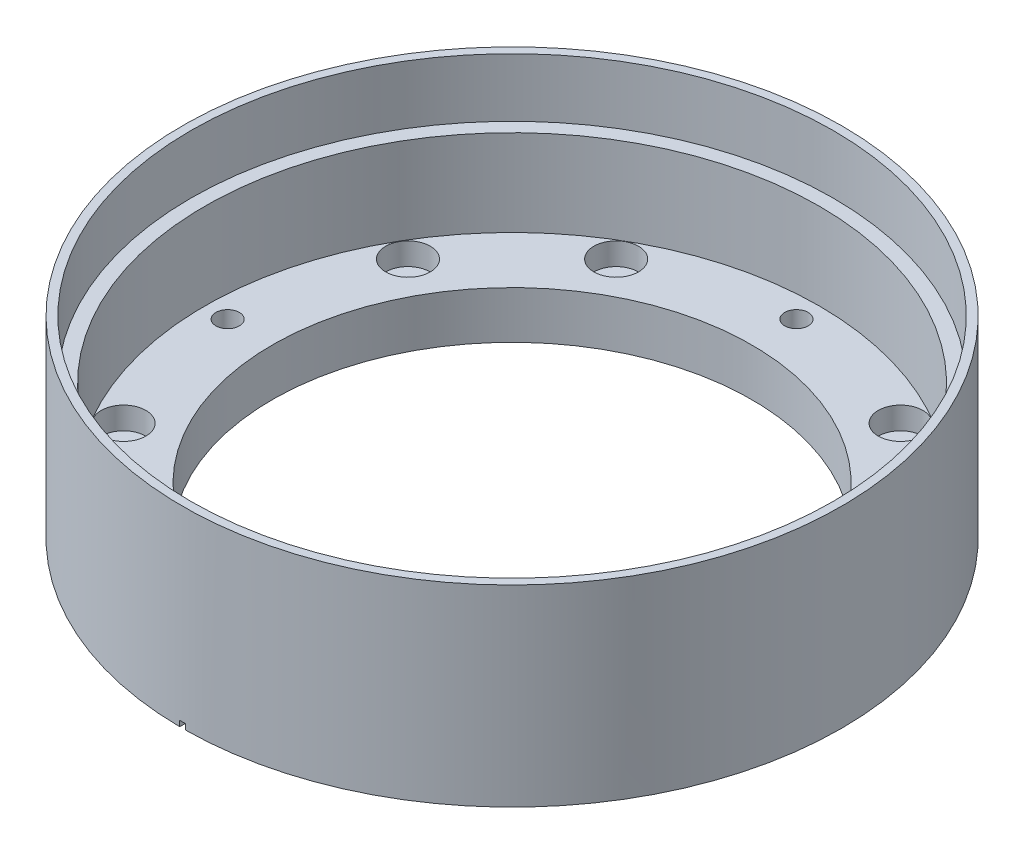
ISO-10303-21;
HEADER;
FILE_DESCRIPTION(('STEP AP214'),'2;1');
FILE_NAME('part.step','',(''),(''),'','','');
FILE_SCHEMA(('AUTOMOTIVE_DESIGN { 1 0 10303 214 1 1 1 1 }'));
ENDSEC;
DATA;
#1=APPLICATION_CONTEXT('core data for automotive mechanical design processes');
#2=APPLICATION_PROTOCOL_DEFINITION('international standard','automotive_design',2000,#1);
#3=PRODUCT_CONTEXT('',#1,'mechanical');
#4=PRODUCT('Part','Part','',(#3));
#5=PRODUCT_RELATED_PRODUCT_CATEGORY('part','',(#4));
#6=PRODUCT_DEFINITION_FORMATION('','',#4);
#7=PRODUCT_DEFINITION_CONTEXT('part definition',#1,'design');
#8=PRODUCT_DEFINITION('design','',#6,#7);
#9=PRODUCT_DEFINITION_SHAPE('','',#8);
#10=(LENGTH_UNIT() NAMED_UNIT(*) SI_UNIT(.MILLI.,.METRE.));
#11=(NAMED_UNIT(*) PLANE_ANGLE_UNIT() SI_UNIT($,.RADIAN.));
#12=(NAMED_UNIT(*) SI_UNIT($,.STERADIAN.) SOLID_ANGLE_UNIT());
#13=UNCERTAINTY_MEASURE_WITH_UNIT(LENGTH_MEASURE(1.E-05),#10,'distance_accuracy_value','');
#14=(GEOMETRIC_REPRESENTATION_CONTEXT(3) GLOBAL_UNCERTAINTY_ASSIGNED_CONTEXT((#13)) GLOBAL_UNIT_ASSIGNED_CONTEXT((#10,
#11,#12)) REPRESENTATION_CONTEXT('',''));
#15=CARTESIAN_POINT('',(0.,0.,0.));
#16=DIRECTION('',(0.,0.,1.));
#17=DIRECTION('',(1.,0.,0.));
#18=AXIS2_PLACEMENT_3D('',#15,#16,#17);
#19=CARTESIAN_POINT('',(0.,34.5,0.));
#20=DIRECTION('',(0.,1.,0.));
#21=DIRECTION('',(0.,0.,1.));
#22=AXIS2_PLACEMENT_3D('',#19,#20,#21);
#23=PLANE('',#22);
#24=CARTESIAN_POINT('',(0.,34.5,0.));
#25=DIRECTION('',(0.,1.,0.));
#26=DIRECTION('',(0.,0.,1.));
#27=AXIS2_PLACEMENT_3D('',#24,#25,#26);
#28=CIRCLE('',#27,57.6);
#29=CARTESIAN_POINT('',(0.,34.5,57.6));
#30=VERTEX_POINT('',#29);
#31=EDGE_CURVE('E254',#30,#30,#28,.T.);
#32=ORIENTED_EDGE('',*,*,#31,.F.);
#33=EDGE_LOOP('',(#32));
#34=FACE_BOUND('',#33,.T.);
#35=CARTESIAN_POINT('',(0.,34.5,0.));
#36=DIRECTION('',(0.,-1.,0.));
#37=DIRECTION('',(0.,0.,-1.));
#38=AXIS2_PLACEMENT_3D('',#35,#36,#37);
#39=CIRCLE('',#38,59.1);
#40=CARTESIAN_POINT('',(0.,34.5,-59.1));
#41=VERTEX_POINT('',#40);
#42=EDGE_CURVE('E152',#41,#41,#39,.T.);
#43=ORIENTED_EDGE('',*,*,#42,.F.);
#44=EDGE_LOOP('',(#43));
#45=FACE_BOUND('',#44,.T.);
#46=ADVANCED_FACE('F40',(#34,#45),#23,.T.);
#47=CARTESIAN_POINT('',(0.,0.,0.));
#48=DIRECTION('',(0.,1.,0.));
#49=DIRECTION('',(0.,0.,1.));
#50=AXIS2_PLACEMENT_3D('',#47,#48,#49);
#51=PLANE('',#50);
#52=CARTESIAN_POINT('',(0.,0.,0.));
#53=DIRECTION('',(0.,1.,0.));
#54=DIRECTION('',(0.,0.,1.));
#55=AXIS2_PLACEMENT_3D('',#52,#53,#54);
#56=CIRCLE('',#55,43.);
#57=CARTESIAN_POINT('',(0.,0.,43.));
#58=VERTEX_POINT('',#57);
#59=EDGE_CURVE('E245',#58,#58,#56,.T.);
#60=ORIENTED_EDGE('',*,*,#59,.T.);
#61=EDGE_LOOP('',(#60));
#62=FACE_BOUND('',#61,.T.);
#63=CARTESIAN_POINT('',(-51.,0.,1.78065548281E-13));
#64=DIRECTION('',(0.,-1.,0.));
#65=DIRECTION('',(0.,0.,-1.));
#66=AXIS2_PLACEMENT_3D('',#63,#64,#65);
#67=CIRCLE('',#66,3.75);
#68=CARTESIAN_POINT('',(-51.,0.,-3.74999999999982));
#69=VERTEX_POINT('',#68);
#70=EDGE_CURVE('E178',#69,#69,#67,.T.);
#71=ORIENTED_EDGE('',*,*,#70,.F.);
#72=EDGE_LOOP('',(#71));
#73=FACE_BOUND('',#72,.T.);
#74=CARTESIAN_POINT('',(0.,0.,-51.));
#75=DIRECTION('',(0.,-1.,0.));
#76=DIRECTION('',(0.,0.,-1.));
#77=AXIS2_PLACEMENT_3D('',#74,#75,#76);
#78=CIRCLE('',#77,3.75);
#79=CARTESIAN_POINT('',(0.,0.,-54.75));
#80=VERTEX_POINT('',#79);
#81=EDGE_CURVE('E172',#80,#80,#78,.T.);
#82=ORIENTED_EDGE('',*,*,#81,.F.);
#83=EDGE_LOOP('',(#82));
#84=FACE_BOUND('',#83,.T.);
#85=CARTESIAN_POINT('',(51.,0.,1.85004442184907E-13));
#86=DIRECTION('',(0.,-1.,0.));
#87=DIRECTION('',(0.,0.,-1.));
#88=AXIS2_PLACEMENT_3D('',#85,#86,#87);
#89=CIRCLE('',#88,3.75);
#90=CARTESIAN_POINT('',(51.,0.,-3.74999999999982));
#91=VERTEX_POINT('',#90);
#92=EDGE_CURVE('E166',#91,#91,#89,.T.);
#93=ORIENTED_EDGE('',*,*,#92,.F.);
#94=EDGE_LOOP('',(#93));
#95=FACE_BOUND('',#94,.T.);
#96=CARTESIAN_POINT('',(-3.56131096562E-13,0.,51.));
#97=DIRECTION('',(0.,-1.,0.));
#98=DIRECTION('',(0.,0.,-1.));
#99=AXIS2_PLACEMENT_3D('',#96,#97,#98);
#100=CIRCLE('',#99,3.75);
#101=CARTESIAN_POINT('',(-3.56131096562E-13,0.,47.25));
#102=VERTEX_POINT('',#101);
#103=EDGE_CURVE('E163',#102,#102,#100,.T.);
#104=ORIENTED_EDGE('',*,*,#103,.F.);
#105=EDGE_LOOP('',(#104));
#106=FACE_BOUND('',#105,.T.);
#107=CARTESIAN_POINT('',(0.,0.,0.));
#108=DIRECTION('',(0.,-1.,0.));
#109=DIRECTION('',(0.,0.,-1.));
#110=AXIS2_PLACEMENT_3D('',#107,#108,#109);
#111=CIRCLE('',#110,59.1);
#112=CARTESIAN_POINT('',(-0.499999999999993,0.,59.0978849029303));
#113=VERTEX_POINT('',#112);
#114=CARTESIAN_POINT('',(-0.499999999999993,0.,-59.0978849029303));
#115=VERTEX_POINT('',#114);
#116=EDGE_CURVE('E134',#113,#115,#111,.T.);
#117=ORIENTED_EDGE('',*,*,#116,.T.);
#118=DIRECTION('',(0.,0.,-1.));
#119=VECTOR('',#118,1.);
#120=CARTESIAN_POINT('',(-0.499999999999993,0.,-58.1));
#121=LINE('',#120,#119);
#122=CARTESIAN_POINT('',(-0.499999999999993,0.,-58.1));
#123=VERTEX_POINT('',#122);
#124=EDGE_CURVE('E112',#123,#115,#121,.T.);
#125=ORIENTED_EDGE('',*,*,#124,.F.);
#126=DIRECTION('',(-1.,0.,0.));
#127=VECTOR('',#126,1.);
#128=CARTESIAN_POINT('',(0.500000000000008,0.,-58.1));
#129=LINE('',#128,#127);
#130=CARTESIAN_POINT('',(0.500000000000008,0.,-58.1));
#131=VERTEX_POINT('',#130);
#132=EDGE_CURVE('E130',#131,#123,#129,.T.);
#133=ORIENTED_EDGE('',*,*,#132,.F.);
#134=DIRECTION('',(0.,0.,1.));
#135=VECTOR('',#134,1.);
#136=CARTESIAN_POINT('',(0.500000000000008,0.,-59.1));
#137=LINE('',#136,#135);
#138=CARTESIAN_POINT('',(0.500000000000008,0.,-59.0978849029303));
#139=VERTEX_POINT('',#138);
#140=EDGE_CURVE('E118',#139,#131,#137,.T.);
#141=ORIENTED_EDGE('',*,*,#140,.F.);
#142=CARTESIAN_POINT('',(0.500000000000008,0.,59.0978849029303));
#143=VERTEX_POINT('',#142);
#144=EDGE_CURVE('E156',#139,#143,#111,.T.);
#145=ORIENTED_EDGE('',*,*,#144,.T.);
#146=DIRECTION('',(0.,0.,1.));
#147=VECTOR('',#146,1.);
#148=CARTESIAN_POINT('',(0.500000000000008,0.,59.1));
#149=LINE('',#148,#147);
#150=CARTESIAN_POINT('',(0.500000000000008,0.,58.1));
#151=VERTEX_POINT('',#150);
#152=EDGE_CURVE('E141',#151,#143,#149,.T.);
#153=ORIENTED_EDGE('',*,*,#152,.F.);
#154=DIRECTION('',(1.,0.,0.));
#155=VECTOR('',#154,1.);
#156=CARTESIAN_POINT('',(0.500000000000008,0.,58.1));
#157=LINE('',#156,#155);
#158=CARTESIAN_POINT('',(-0.499999999999993,0.,58.1));
#159=VERTEX_POINT('',#158);
#160=EDGE_CURVE('E143',#159,#151,#157,.T.);
#161=ORIENTED_EDGE('',*,*,#160,.F.);
#162=DIRECTION('',(0.,0.,-1.));
#163=VECTOR('',#162,1.);
#164=CARTESIAN_POINT('',(-0.499999999999993,0.,58.1));
#165=LINE('',#164,#163);
#166=EDGE_CURVE('E131',#113,#159,#165,.T.);
#167=ORIENTED_EDGE('',*,*,#166,.F.);
#168=EDGE_LOOP('',(#117,#125,#133,#141,#145,#153,#161,#167));
#169=FACE_BOUND('',#168,.T.);
#170=ADVANCED_FACE('F42',(#62,#73,#84,#95,#106,#169),#51,.F.);
#171=CARTESIAN_POINT('',(-51.,0.,-5.34196644842999E-13));
#172=DIRECTION('',(0.,1.,0.));
#173=DIRECTION('',(0.,0.,1.));
#174=AXIS2_PLACEMENT_3D('',#171,#172,#173);
#175=CYLINDRICAL_SURFACE('',#174,2.1);
#176=CARTESIAN_POINT('',(-51.,8.5,-5.34196644842999E-13));
#177=DIRECTION('',(0.,1.,0.));
#178=DIRECTION('',(0.,0.,1.));
#179=AXIS2_PLACEMENT_3D('',#176,#177,#178);
#180=CIRCLE('',#179,2.1);
#181=CARTESIAN_POINT('',(-51.,8.5,2.09999999999947));
#182=VERTEX_POINT('',#181);
#183=EDGE_CURVE('E193',#182,#182,#180,.T.);
#184=ORIENTED_EDGE('',*,*,#183,.T.);
#185=EDGE_LOOP('',(#184));
#186=FACE_BOUND('',#185,.T.);
#187=CARTESIAN_POINT('',(-51.,5.,-5.34196644842999E-13));
#188=DIRECTION('',(0.,-1.,0.));
#189=DIRECTION('',(0.,0.,-1.));
#190=AXIS2_PLACEMENT_3D('',#187,#188,#189);
#191=CIRCLE('',#190,2.1);
#192=CARTESIAN_POINT('',(-51.,5.,-2.10000000000053));
#193=VERTEX_POINT('',#192);
#194=EDGE_CURVE('E196',#193,#193,#191,.F.);
#195=ORIENTED_EDGE('',*,*,#194,.F.);
#196=EDGE_LOOP('',(#195));
#197=FACE_BOUND('',#196,.T.);
#198=ADVANCED_FACE('F320',(#186,#197),#175,.F.);
#199=CARTESIAN_POINT('',(-3.56131096562E-13,0.,51.));
#200=DIRECTION('',(0.,1.,0.));
#201=DIRECTION('',(0.,0.,1.));
#202=AXIS2_PLACEMENT_3D('',#199,#200,#201);
#203=CYLINDRICAL_SURFACE('',#202,2.1);
#204=CARTESIAN_POINT('',(-3.56131096562E-13,8.5,51.));
#205=DIRECTION('',(0.,1.,0.));
#206=DIRECTION('',(0.,0.,1.));
#207=AXIS2_PLACEMENT_3D('',#204,#205,#206);
#208=CIRCLE('',#207,2.1);
#209=CARTESIAN_POINT('',(-3.56131096562E-13,8.5,53.1));
#210=VERTEX_POINT('',#209);
#211=EDGE_CURVE('E190',#210,#210,#208,.T.);
#212=ORIENTED_EDGE('',*,*,#211,.T.);
#213=EDGE_LOOP('',(#212));
#214=FACE_BOUND('',#213,.T.);
#215=CARTESIAN_POINT('',(-3.56131096562E-13,5.,51.));
#216=DIRECTION('',(0.,-1.,0.));
#217=DIRECTION('',(0.,0.,-1.));
#218=AXIS2_PLACEMENT_3D('',#215,#216,#217);
#219=CIRCLE('',#218,2.1);
#220=CARTESIAN_POINT('',(-3.56131096562E-13,5.,48.9));
#221=VERTEX_POINT('',#220);
#222=EDGE_CURVE('E268',#221,#221,#219,.F.);
#223=ORIENTED_EDGE('',*,*,#222,.F.);
#224=EDGE_LOOP('',(#223));
#225=FACE_BOUND('',#224,.T.);
#226=ADVANCED_FACE('F413',(#214,#225),#203,.F.);
#227=CARTESIAN_POINT('',(51.,0.,1.78065548281E-13));
#228=DIRECTION('',(0.,1.,0.));
#229=DIRECTION('',(0.,0.,1.));
#230=AXIS2_PLACEMENT_3D('',#227,#228,#229);
#231=CYLINDRICAL_SURFACE('',#230,2.1);
#232=CARTESIAN_POINT('',(51.,8.5,1.78065548281E-13));
#233=DIRECTION('',(0.,1.,0.));
#234=DIRECTION('',(0.,0.,1.));
#235=AXIS2_PLACEMENT_3D('',#232,#233,#234);
#236=CIRCLE('',#235,2.1);
#237=CARTESIAN_POINT('',(51.,8.5,2.10000000000018));
#238=VERTEX_POINT('',#237);
#239=EDGE_CURVE('E187',#238,#238,#236,.T.);
#240=ORIENTED_EDGE('',*,*,#239,.T.);
#241=EDGE_LOOP('',(#240));
#242=FACE_BOUND('',#241,.T.);
#243=CARTESIAN_POINT('',(51.,5.,1.78065548281E-13));
#244=DIRECTION('',(0.,-1.,0.));
#245=DIRECTION('',(0.,0.,-1.));
#246=AXIS2_PLACEMENT_3D('',#243,#244,#245);
#247=CIRCLE('',#246,2.1);
#248=CARTESIAN_POINT('',(51.,5.,-2.09999999999982));
#249=VERTEX_POINT('',#248);
#250=EDGE_CURVE('E265',#249,#249,#247,.F.);
#251=ORIENTED_EDGE('',*,*,#250,.F.);
#252=EDGE_LOOP('',(#251));
#253=FACE_BOUND('',#252,.T.);
#254=ADVANCED_FACE('F417',(#242,#253),#231,.F.);
#255=CARTESIAN_POINT('',(0.,0.,-51.));
#256=DIRECTION('',(0.,1.,0.));
#257=DIRECTION('',(0.,0.,1.));
#258=AXIS2_PLACEMENT_3D('',#255,#256,#257);
#259=CYLINDRICAL_SURFACE('',#258,2.1);
#260=CARTESIAN_POINT('',(0.,8.5,-51.));
#261=DIRECTION('',(0.,1.,0.));
#262=DIRECTION('',(0.,0.,1.));
#263=AXIS2_PLACEMENT_3D('',#260,#261,#262);
#264=CIRCLE('',#263,2.1);
#265=CARTESIAN_POINT('',(0.,8.5,-48.9));
#266=VERTEX_POINT('',#265);
#267=EDGE_CURVE('E183',#266,#266,#264,.T.);
#268=ORIENTED_EDGE('',*,*,#267,.T.);
#269=EDGE_LOOP('',(#268));
#270=FACE_BOUND('',#269,.T.);
#271=CARTESIAN_POINT('',(0.,5.,-51.));
#272=DIRECTION('',(0.,-1.,0.));
#273=DIRECTION('',(0.,0.,-1.));
#274=AXIS2_PLACEMENT_3D('',#271,#272,#273);
#275=CIRCLE('',#274,2.1);
#276=CARTESIAN_POINT('',(0.,5.,-53.1));
#277=VERTEX_POINT('',#276);
#278=EDGE_CURVE('E162',#277,#277,#275,.F.);
#279=ORIENTED_EDGE('',*,*,#278,.F.);
#280=EDGE_LOOP('',(#279));
#281=FACE_BOUND('',#280,.T.);
#282=ADVANCED_FACE('F329',(#270,#281),#259,.F.);
#283=CARTESIAN_POINT('',(0.,24.,0.));
#284=DIRECTION('',(0.,1.,0.));
#285=DIRECTION('',(0.,0.,1.));
#286=AXIS2_PLACEMENT_3D('',#283,#284,#285);
#287=CYLINDRICAL_SURFACE('',#286,57.6);
#288=CARTESIAN_POINT('',(0.,24.,0.));
#289=DIRECTION('',(0.,1.,0.));
#290=DIRECTION('',(0.,0.,1.));
#291=AXIS2_PLACEMENT_3D('',#288,#289,#290);
#292=CIRCLE('',#291,57.6);
#293=CARTESIAN_POINT('',(0.,24.,57.6));
#294=VERTEX_POINT('',#293);
#295=EDGE_CURVE('E257',#294,#294,#292,.T.);
#296=CARTESIAN_POINT('',(0.,24.,57.6));
#297=CARTESIAN_POINT('',(0.,24.109375,57.6));
#298=CARTESIAN_POINT('',(0.,24.21875,57.6));
#299=CARTESIAN_POINT('',(0.,24.4375,57.6));
#300=CARTESIAN_POINT('',(0.,24.546875,57.6));
#301=CARTESIAN_POINT('',(0.,24.765625,57.6));
#302=CARTESIAN_POINT('',(0.,24.875,57.6));
#303=CARTESIAN_POINT('',(0.,25.09375,57.6));
#304=CARTESIAN_POINT('',(0.,25.203125,57.6));
#305=CARTESIAN_POINT('',(0.,25.421875,57.6));
#306=CARTESIAN_POINT('',(0.,25.53125,57.6));
#307=CARTESIAN_POINT('',(0.,25.75,57.6));
#308=CARTESIAN_POINT('',(0.,25.859375,57.6));
#309=CARTESIAN_POINT('',(0.,26.078125,57.6));
#310=CARTESIAN_POINT('',(0.,26.1875,57.6));
#311=CARTESIAN_POINT('',(0.,26.40625,57.6));
#312=CARTESIAN_POINT('',(0.,26.515625,57.6));
#313=CARTESIAN_POINT('',(0.,26.734375,57.6));
#314=CARTESIAN_POINT('',(0.,26.84375,57.6));
#315=CARTESIAN_POINT('',(0.,27.0625,57.6));
#316=CARTESIAN_POINT('',(0.,27.171875,57.6));
#317=CARTESIAN_POINT('',(0.,27.390625,57.6));
#318=CARTESIAN_POINT('',(0.,27.5,57.6));
#319=CARTESIAN_POINT('',(0.,27.71875,57.6));
#320=CARTESIAN_POINT('',(0.,27.828125,57.6));
#321=CARTESIAN_POINT('',(0.,28.046875,57.6));
#322=CARTESIAN_POINT('',(0.,28.15625,57.6));
#323=CARTESIAN_POINT('',(0.,28.375,57.6));
#324=CARTESIAN_POINT('',(0.,28.484375,57.6));
#325=CARTESIAN_POINT('',(0.,28.703125,57.6));
#326=CARTESIAN_POINT('',(0.,28.8125,57.6));
#327=CARTESIAN_POINT('',(0.,29.03125,57.6));
#328=CARTESIAN_POINT('',(0.,29.140625,57.6));
#329=CARTESIAN_POINT('',(0.,29.359375,57.6));
#330=CARTESIAN_POINT('',(0.,29.46875,57.6));
#331=CARTESIAN_POINT('',(0.,29.6875,57.6));
#332=CARTESIAN_POINT('',(0.,29.796875,57.6));
#333=CARTESIAN_POINT('',(0.,30.015625,57.6));
#334=CARTESIAN_POINT('',(0.,30.125,57.6));
#335=CARTESIAN_POINT('',(0.,30.34375,57.6));
#336=CARTESIAN_POINT('',(0.,30.453125,57.6));
#337=CARTESIAN_POINT('',(0.,30.671875,57.6));
#338=CARTESIAN_POINT('',(0.,30.78125,57.6));
#339=CARTESIAN_POINT('',(0.,31.,57.6));
#340=CARTESIAN_POINT('',(0.,31.109375,57.6));
#341=CARTESIAN_POINT('',(0.,31.328125,57.6));
#342=CARTESIAN_POINT('',(0.,31.4375,57.6));
#343=CARTESIAN_POINT('',(0.,31.65625,57.6));
#344=CARTESIAN_POINT('',(0.,31.765625,57.6));
#345=CARTESIAN_POINT('',(0.,31.984375,57.6));
#346=CARTESIAN_POINT('',(0.,32.09375,57.6));
#347=CARTESIAN_POINT('',(0.,32.3125,57.6));
#348=CARTESIAN_POINT('',(0.,32.421875,57.6));
#349=CARTESIAN_POINT('',(0.,32.640625,57.6));
#350=CARTESIAN_POINT('',(0.,32.75,57.6));
#351=CARTESIAN_POINT('',(0.,32.96875,57.6));
#352=CARTESIAN_POINT('',(0.,33.078125,57.6));
#353=CARTESIAN_POINT('',(0.,33.296875,57.6));
#354=CARTESIAN_POINT('',(0.,33.40625,57.6));
#355=CARTESIAN_POINT('',(0.,33.625,57.6));
#356=CARTESIAN_POINT('',(0.,33.734375,57.6));
#357=CARTESIAN_POINT('',(0.,33.953125,57.6));
#358=CARTESIAN_POINT('',(0.,34.0625,57.6));
#359=CARTESIAN_POINT('',(0.,34.28125,57.6));
#360=CARTESIAN_POINT('',(0.,34.390625,57.6));
#361=CARTESIAN_POINT('',(0.,34.5,57.6));
#362=B_SPLINE_CURVE_WITH_KNOTS('',3,(#296,#297,#298,#299,#300,#301,#302,#303,#304,#305,#306,
#307,#308,#309,#310,#311,#312,#313,#314,#315,#316,#317,#318,#319,#320,#321,#322,#323,#324,#325,
#326,#327,#328,#329,#330,#331,#332,#333,#334,#335,#336,#337,#338,#339,#340,#341,#342,#343,#344,
#345,#346,#347,#348,#349,#350,#351,#352,#353,#354,#355,#356,#357,#358,#359,#360,#361),
.UNSPECIFIED.,.F.,.F.,(4,2,2,2,2,2,2,2,2,2,2,2,2,2,2,2,2,2,2,2,2,2,2,2,2,2,2,2,2,2,2,2,4),(0.,
0.328124999999999,0.656249999999997,0.984374999999999,1.3125,1.640625,1.96875,2.296875,2.625,
2.953125,3.28125,3.609375,3.9375,4.265625,4.59375,4.921875,5.25,5.578125,5.90625,6.234375,
6.5625,6.890625,7.21875,7.546875,7.875,8.203125,8.53125,8.859375,9.18749999999999,
9.51562499999999,9.84375,10.171875,10.5),.UNSPECIFIED.);
#363=EDGE_CURVE('BSEAM325',#294,#30,#362,.T.);
#364=ORIENTED_EDGE('',*,*,#295,.F.);
#365=ORIENTED_EDGE('',*,*,#31,.T.);
#366=ORIENTED_EDGE('',*,*,#363,.T.);
#367=ORIENTED_EDGE('',*,*,#363,.F.);
#368=EDGE_LOOP('',(#364,#366,#365,#367));
#369=FACE_BOUND('',#368,.T.);
#370=ADVANCED_FACE('F325',(#369),#287,.F.);
#371=CARTESIAN_POINT('',(0.,24.,0.));
#372=DIRECTION('',(0.,1.,0.));
#373=DIRECTION('',(0.,0.,1.));
#374=AXIS2_PLACEMENT_3D('',#371,#372,#373);
#375=PLANE('',#374);
#376=CARTESIAN_POINT('',(0.,24.,0.));
#377=DIRECTION('',(0.,1.,0.));
#378=DIRECTION('',(0.,0.,1.));
#379=AXIS2_PLACEMENT_3D('',#376,#377,#378);
#380=CIRCLE('',#379,55.1);
#381=CARTESIAN_POINT('',(0.,24.,55.1));
#382=VERTEX_POINT('',#381);
#383=EDGE_CURVE('E248',#382,#382,#380,.T.);
#384=ORIENTED_EDGE('',*,*,#383,.F.);
#385=EDGE_LOOP('',(#384));
#386=FACE_BOUND('',#385,.T.);
#387=ORIENTED_EDGE('',*,*,#295,.T.);
#388=EDGE_LOOP('',(#387));
#389=FACE_BOUND('',#388,.T.);
#390=ADVANCED_FACE('F328',(#386,#389),#375,.T.);
#391=CARTESIAN_POINT('',(0.,8.5,0.));
#392=DIRECTION('',(0.,1.,0.));
#393=DIRECTION('',(0.,0.,1.));
#394=AXIS2_PLACEMENT_3D('',#391,#392,#393);
#395=CYLINDRICAL_SURFACE('',#394,55.1);
#396=CARTESIAN_POINT('',(0.,8.5,0.));
#397=DIRECTION('',(0.,1.,0.));
#398=DIRECTION('',(0.,0.,1.));
#399=AXIS2_PLACEMENT_3D('',#396,#397,#398);
#400=CIRCLE('',#399,55.1);
#401=CARTESIAN_POINT('',(0.,8.5,55.1));
#402=VERTEX_POINT('',#401);
#403=EDGE_CURVE('E251',#402,#402,#400,.T.);
#404=ORIENTED_EDGE('',*,*,#403,.F.);
#405=EDGE_LOOP('',(#404));
#406=FACE_BOUND('',#405,.T.);
#407=ORIENTED_EDGE('',*,*,#383,.T.);
#408=EDGE_LOOP('',(#407));
#409=FACE_BOUND('',#408,.T.);
#410=ADVANCED_FACE('F333',(#406,#409),#395,.F.);
#411=CARTESIAN_POINT('',(0.,8.5,0.));
#412=DIRECTION('',(0.,1.,0.));
#413=DIRECTION('',(0.,0.,1.));
#414=AXIS2_PLACEMENT_3D('',#411,#412,#413);
#415=PLANE('',#414);
#416=ORIENTED_EDGE('',*,*,#267,.F.);
#417=EDGE_LOOP('',(#416));
#418=FACE_BOUND('',#417,.T.);
#419=ORIENTED_EDGE('',*,*,#239,.F.);
#420=EDGE_LOOP('',(#419));
#421=FACE_BOUND('',#420,.T.);
#422=ORIENTED_EDGE('',*,*,#211,.F.);
#423=EDGE_LOOP('',(#422));
#424=FACE_BOUND('',#423,.T.);
#425=ORIENTED_EDGE('',*,*,#183,.F.);
#426=EDGE_LOOP('',(#425));
#427=FACE_BOUND('',#426,.T.);
#428=CARTESIAN_POINT('',(-25.4999999999999,8.5,-44.1672955930064));
#429=DIRECTION('',(0.,1.,0.));
#430=DIRECTION('',(0.,0.,1.));
#431=AXIS2_PLACEMENT_3D('',#428,#429,#430);
#432=CIRCLE('',#431,4.);
#433=CARTESIAN_POINT('',(-25.4999999999999,8.5,-40.1672955930064));
#434=VERTEX_POINT('',#433);
#435=EDGE_CURVE('E215',#434,#434,#432,.T.);
#436=ORIENTED_EDGE('',*,*,#435,.F.);
#437=EDGE_LOOP('',(#436));
#438=FACE_BOUND('',#437,.T.);
#439=CARTESIAN_POINT('',(25.5000000000002,8.5,-44.1672955930063));
#440=DIRECTION('',(0.,1.,0.));
#441=DIRECTION('',(0.,0.,1.));
#442=AXIS2_PLACEMENT_3D('',#439,#440,#441);
#443=CIRCLE('',#442,4.);
#444=CARTESIAN_POINT('',(25.5000000000002,8.5,-40.1672955930063));
#445=VERTEX_POINT('',#444);
#446=EDGE_CURVE('E222',#445,#445,#443,.T.);
#447=ORIENTED_EDGE('',*,*,#446,.F.);
#448=EDGE_LOOP('',(#447));
#449=FACE_BOUND('',#448,.T.);
#450=CARTESIAN_POINT('',(44.1672955930065,8.5,-25.4999999999998));
#451=DIRECTION('',(0.,1.,0.));
#452=DIRECTION('',(0.,0.,1.));
#453=AXIS2_PLACEMENT_3D('',#450,#451,#452);
#454=CIRCLE('',#453,4.);
#455=CARTESIAN_POINT('',(44.1672955930065,8.5,-21.4999999999998));
#456=VERTEX_POINT('',#455);
#457=EDGE_CURVE('E228',#456,#456,#454,.T.);
#458=ORIENTED_EDGE('',*,*,#457,.F.);
#459=EDGE_LOOP('',(#458));
#460=FACE_BOUND('',#459,.T.);
#461=CARTESIAN_POINT('',(44.1672955930062,8.5,25.5000000000003));
#462=DIRECTION('',(0.,1.,0.));
#463=DIRECTION('',(0.,0.,1.));
#464=AXIS2_PLACEMENT_3D('',#461,#462,#463);
#465=CIRCLE('',#464,4.);
#466=CARTESIAN_POINT('',(44.1672955930062,8.5,29.5000000000003));
#467=VERTEX_POINT('',#466);
#468=EDGE_CURVE('E234',#467,#467,#465,.T.);
#469=ORIENTED_EDGE('',*,*,#468,.F.);
#470=EDGE_LOOP('',(#469));
#471=FACE_BOUND('',#470,.T.);
#472=CARTESIAN_POINT('',(25.4999999999996,8.5,44.1672955930066));
#473=DIRECTION('',(0.,1.,0.));
#474=DIRECTION('',(0.,0.,1.));
#475=AXIS2_PLACEMENT_3D('',#472,#473,#474);
#476=CIRCLE('',#475,4.);
#477=CARTESIAN_POINT('',(25.4999999999996,8.5,48.1672955930066));
#478=VERTEX_POINT('',#477);
#479=EDGE_CURVE('E197',#478,#478,#476,.T.);
#480=ORIENTED_EDGE('',*,*,#479,.F.);
#481=EDGE_LOOP('',(#480));
#482=FACE_BOUND('',#481,.T.);
#483=CARTESIAN_POINT('',(-25.5000000000005,8.5,44.1672955930061));
#484=DIRECTION('',(0.,1.,0.));
#485=DIRECTION('',(0.,0.,1.));
#486=AXIS2_PLACEMENT_3D('',#483,#484,#485);
#487=CIRCLE('',#486,4.00000000000001);
#488=CARTESIAN_POINT('',(-25.5000000000005,8.5,48.1672955930061));
#489=VERTEX_POINT('',#488);
#490=EDGE_CURVE('E204',#489,#489,#487,.T.);
#491=ORIENTED_EDGE('',*,*,#490,.F.);
#492=EDGE_LOOP('',(#491));
#493=FACE_BOUND('',#492,.T.);
#494=CARTESIAN_POINT('',(-44.1672955930067,8.5,25.4999999999995));
#495=DIRECTION('',(0.,1.,0.));
#496=DIRECTION('',(0.,0.,1.));
#497=AXIS2_PLACEMENT_3D('',#494,#495,#496);
#498=CIRCLE('',#497,4.);
#499=CARTESIAN_POINT('',(-44.1672955930067,8.5,29.4999999999995));
#500=VERTEX_POINT('',#499);
#501=EDGE_CURVE('E210',#500,#500,#498,.T.);
#502=ORIENTED_EDGE('',*,*,#501,.F.);
#503=EDGE_LOOP('',(#502));
#504=FACE_BOUND('',#503,.T.);
#505=CARTESIAN_POINT('',(-44.1672955930064,8.5,-25.5));
#506=DIRECTION('',(0.,1.,0.));
#507=DIRECTION('',(0.,0.,1.));
#508=AXIS2_PLACEMENT_3D('',#505,#506,#507);
#509=CIRCLE('',#508,4.);
#510=CARTESIAN_POINT('',(-44.1672955930064,8.5,-21.5));
#511=VERTEX_POINT('',#510);
#512=EDGE_CURVE('E218',#511,#511,#509,.T.);
#513=ORIENTED_EDGE('',*,*,#512,.F.);
#514=EDGE_LOOP('',(#513));
#515=FACE_BOUND('',#514,.T.);
#516=CARTESIAN_POINT('',(0.,8.5,0.));
#517=DIRECTION('',(0.,1.,0.));
#518=DIRECTION('',(0.,0.,1.));
#519=AXIS2_PLACEMENT_3D('',#516,#517,#518);
#520=CIRCLE('',#519,43.);
#521=CARTESIAN_POINT('',(0.,8.5,43.));
#522=VERTEX_POINT('',#521);
#523=EDGE_CURVE('E242',#522,#522,#520,.T.);
#524=ORIENTED_EDGE('',*,*,#523,.F.);
#525=EDGE_LOOP('',(#524));
#526=FACE_BOUND('',#525,.T.);
#527=ORIENTED_EDGE('',*,*,#403,.T.);
#528=EDGE_LOOP('',(#527));
#529=FACE_BOUND('',#528,.T.);
#530=ADVANCED_FACE('F337',(#418,#421,#424,#427,#438,#449,#460,#471,#482,#493,#504,#515,#526,
#529),#415,.T.);
#531=CARTESIAN_POINT('',(0.,0.,0.));
#532=DIRECTION('',(0.,1.,0.));
#533=DIRECTION('',(0.,0.,1.));
#534=AXIS2_PLACEMENT_3D('',#531,#532,#533);
#535=CYLINDRICAL_SURFACE('',#534,43.);
#536=ORIENTED_EDGE('',*,*,#59,.F.);
#537=EDGE_LOOP('',(#536));
#538=FACE_BOUND('',#537,.T.);
#539=ORIENTED_EDGE('',*,*,#523,.T.);
#540=EDGE_LOOP('',(#539));
#541=FACE_BOUND('',#540,.T.);
#542=ADVANCED_FACE('F341',(#538,#541),#535,.F.);
#543=CARTESIAN_POINT('',(-44.1672955930064,4.5,-25.5));
#544=DIRECTION('',(0.,1.,0.));
#545=DIRECTION('',(0.,0.,1.));
#546=AXIS2_PLACEMENT_3D('',#543,#544,#545);
#547=CYLINDRICAL_SURFACE('',#546,4.);
#548=CARTESIAN_POINT('',(-44.1672955930064,4.5,-25.5));
#549=DIRECTION('',(0.,1.,0.));
#550=DIRECTION('',(0.,0.,1.));
#551=AXIS2_PLACEMENT_3D('',#548,#549,#550);
#552=CIRCLE('',#551,4.);
#553=CARTESIAN_POINT('',(-44.1672955930064,4.5,-21.5));
#554=VERTEX_POINT('',#553);
#555=EDGE_CURVE('E239',#554,#554,#552,.T.);
#556=ORIENTED_EDGE('',*,*,#555,.F.);
#557=EDGE_LOOP('',(#556));
#558=FACE_BOUND('',#557,.T.);
#559=ORIENTED_EDGE('',*,*,#512,.T.);
#560=EDGE_LOOP('',(#559));
#561=FACE_BOUND('',#560,.T.);
#562=ADVANCED_FACE('F345',(#558,#561),#547,.F.);
#563=CARTESIAN_POINT('',(-44.1672955930064,4.5,-25.5));
#564=DIRECTION('',(0.,1.,0.));
#565=DIRECTION('',(0.,0.,1.));
#566=AXIS2_PLACEMENT_3D('',#563,#564,#565);
#567=PLANE('',#566);
#568=ORIENTED_EDGE('',*,*,#555,.T.);
#569=EDGE_LOOP('',(#568));
#570=FACE_BOUND('',#569,.T.);
#571=ADVANCED_FACE('F349',(#570),#567,.T.);
#572=CARTESIAN_POINT('',(-44.1672955930067,4.5,25.4999999999995));
#573=DIRECTION('',(0.,1.,0.));
#574=DIRECTION('',(0.,0.,1.));
#575=AXIS2_PLACEMENT_3D('',#572,#573,#574);
#576=CYLINDRICAL_SURFACE('',#575,4.);
#577=CARTESIAN_POINT('',(-44.1672955930067,4.5,25.4999999999995));
#578=DIRECTION('',(0.,1.,0.));
#579=DIRECTION('',(0.,0.,1.));
#580=AXIS2_PLACEMENT_3D('',#577,#578,#579);
#581=CIRCLE('',#580,4.);
#582=CARTESIAN_POINT('',(-44.1672955930067,4.5,29.4999999999995));
#583=VERTEX_POINT('',#582);
#584=EDGE_CURVE('E186',#583,#583,#581,.T.);
#585=ORIENTED_EDGE('',*,*,#584,.F.);
#586=EDGE_LOOP('',(#585));
#587=FACE_BOUND('',#586,.T.);
#588=ORIENTED_EDGE('',*,*,#501,.T.);
#589=EDGE_LOOP('',(#588));
#590=FACE_BOUND('',#589,.T.);
#591=ADVANCED_FACE('F353',(#587,#590),#576,.F.);
#592=CARTESIAN_POINT('',(-44.1672955930067,4.5,25.4999999999995));
#593=DIRECTION('',(0.,1.,0.));
#594=DIRECTION('',(0.,0.,1.));
#595=AXIS2_PLACEMENT_3D('',#592,#593,#594);
#596=PLANE('',#595);
#597=ORIENTED_EDGE('',*,*,#584,.T.);
#598=EDGE_LOOP('',(#597));
#599=FACE_BOUND('',#598,.T.);
#600=ADVANCED_FACE('F389',(#599),#596,.T.);
#601=CARTESIAN_POINT('',(-25.5000000000005,4.5,44.1672955930061));
#602=DIRECTION('',(0.,1.,0.));
#603=DIRECTION('',(0.,0.,1.));
#604=AXIS2_PLACEMENT_3D('',#601,#602,#603);
#605=CYLINDRICAL_SURFACE('',#604,4.00000000000001);
#606=CARTESIAN_POINT('',(-25.5000000000005,4.5,44.1672955930061));
#607=DIRECTION('',(0.,1.,0.));
#608=DIRECTION('',(0.,0.,1.));
#609=AXIS2_PLACEMENT_3D('',#606,#607,#608);
#610=CIRCLE('',#609,4.00000000000001);
#611=CARTESIAN_POINT('',(-25.5000000000005,4.5,48.1672955930061));
#612=VERTEX_POINT('',#611);
#613=EDGE_CURVE('E207',#612,#612,#610,.T.);
#614=ORIENTED_EDGE('',*,*,#613,.F.);
#615=EDGE_LOOP('',(#614));
#616=FACE_BOUND('',#615,.T.);
#617=ORIENTED_EDGE('',*,*,#490,.T.);
#618=EDGE_LOOP('',(#617));
#619=FACE_BOUND('',#618,.T.);
#620=ADVANCED_FACE('F392',(#616,#619),#605,.F.);
#621=CARTESIAN_POINT('',(-25.5000000000005,4.5,44.1672955930061));
#622=DIRECTION('',(0.,1.,0.));
#623=DIRECTION('',(0.,0.,1.));
#624=AXIS2_PLACEMENT_3D('',#621,#622,#623);
#625=PLANE('',#624);
#626=ORIENTED_EDGE('',*,*,#613,.T.);
#627=EDGE_LOOP('',(#626));
#628=FACE_BOUND('',#627,.T.);
#629=ADVANCED_FACE('F397',(#628),#625,.T.);
#630=CARTESIAN_POINT('',(25.4999999999996,4.5,44.1672955930066));
#631=DIRECTION('',(0.,1.,0.));
#632=DIRECTION('',(0.,0.,1.));
#633=AXIS2_PLACEMENT_3D('',#630,#631,#632);
#634=CYLINDRICAL_SURFACE('',#633,4.);
#635=CARTESIAN_POINT('',(25.4999999999996,4.5,44.1672955930066));
#636=DIRECTION('',(0.,1.,0.));
#637=DIRECTION('',(0.,0.,1.));
#638=AXIS2_PLACEMENT_3D('',#635,#636,#637);
#639=CIRCLE('',#638,4.);
#640=CARTESIAN_POINT('',(25.4999999999996,4.5,48.1672955930066));
#641=VERTEX_POINT('',#640);
#642=EDGE_CURVE('E201',#641,#641,#639,.T.);
#643=ORIENTED_EDGE('',*,*,#642,.F.);
#644=EDGE_LOOP('',(#643));
#645=FACE_BOUND('',#644,.T.);
#646=ORIENTED_EDGE('',*,*,#479,.T.);
#647=EDGE_LOOP('',(#646));
#648=FACE_BOUND('',#647,.T.);
#649=ADVANCED_FACE('F400',(#645,#648),#634,.F.);
#650=CARTESIAN_POINT('',(25.4999999999996,4.5,44.1672955930066));
#651=DIRECTION('',(0.,1.,0.));
#652=DIRECTION('',(0.,0.,1.));
#653=AXIS2_PLACEMENT_3D('',#650,#651,#652);
#654=PLANE('',#653);
#655=ORIENTED_EDGE('',*,*,#642,.T.);
#656=EDGE_LOOP('',(#655));
#657=FACE_BOUND('',#656,.T.);
#658=ADVANCED_FACE('F363',(#657),#654,.T.);
#659=CARTESIAN_POINT('',(44.1672955930062,4.5,25.5000000000003));
#660=DIRECTION('',(0.,1.,0.));
#661=DIRECTION('',(0.,0.,1.));
#662=AXIS2_PLACEMENT_3D('',#659,#660,#661);
#663=CYLINDRICAL_SURFACE('',#662,4.);
#664=CARTESIAN_POINT('',(44.1672955930062,4.5,25.5000000000003));
#665=DIRECTION('',(0.,1.,0.));
#666=DIRECTION('',(0.,0.,1.));
#667=AXIS2_PLACEMENT_3D('',#664,#665,#666);
#668=CIRCLE('',#667,4.);
#669=CARTESIAN_POINT('',(44.1672955930062,4.5,29.5000000000003));
#670=VERTEX_POINT('',#669);
#671=EDGE_CURVE('E200',#670,#670,#668,.T.);
#672=ORIENTED_EDGE('',*,*,#671,.F.);
#673=EDGE_LOOP('',(#672));
#674=FACE_BOUND('',#673,.T.);
#675=ORIENTED_EDGE('',*,*,#468,.T.);
#676=EDGE_LOOP('',(#675));
#677=FACE_BOUND('',#676,.T.);
#678=ADVANCED_FACE('F359',(#674,#677),#663,.F.);
#679=CARTESIAN_POINT('',(44.1672955930062,4.5,25.5000000000003));
#680=DIRECTION('',(0.,1.,0.));
#681=DIRECTION('',(0.,0.,1.));
#682=AXIS2_PLACEMENT_3D('',#679,#680,#681);
#683=PLANE('',#682);
#684=ORIENTED_EDGE('',*,*,#671,.T.);
#685=EDGE_LOOP('',(#684));
#686=FACE_BOUND('',#685,.T.);
#687=ADVANCED_FACE('F355',(#686),#683,.T.);
#688=CARTESIAN_POINT('',(44.1672955930065,4.5,-25.4999999999998));
#689=DIRECTION('',(0.,1.,0.));
#690=DIRECTION('',(0.,0.,1.));
#691=AXIS2_PLACEMENT_3D('',#688,#689,#690);
#692=CYLINDRICAL_SURFACE('',#691,4.);
#693=CARTESIAN_POINT('',(44.1672955930065,4.5,-25.4999999999998));
#694=DIRECTION('',(0.,1.,0.));
#695=DIRECTION('',(0.,0.,1.));
#696=AXIS2_PLACEMENT_3D('',#693,#694,#695);
#697=CIRCLE('',#696,4.);
#698=CARTESIAN_POINT('',(44.1672955930065,4.5,-21.4999999999998));
#699=VERTEX_POINT('',#698);
#700=EDGE_CURVE('E231',#699,#699,#697,.T.);
#701=ORIENTED_EDGE('',*,*,#700,.F.);
#702=EDGE_LOOP('',(#701));
#703=FACE_BOUND('',#702,.T.);
#704=ORIENTED_EDGE('',*,*,#457,.T.);
#705=EDGE_LOOP('',(#704));
#706=FACE_BOUND('',#705,.T.);
#707=ADVANCED_FACE('F358',(#703,#706),#692,.F.);
#708=CARTESIAN_POINT('',(44.1672955930065,4.5,-25.4999999999998));
#709=DIRECTION('',(0.,1.,0.));
#710=DIRECTION('',(0.,0.,1.));
#711=AXIS2_PLACEMENT_3D('',#708,#709,#710);
#712=PLANE('',#711);
#713=ORIENTED_EDGE('',*,*,#700,.T.);
#714=EDGE_LOOP('',(#713));
#715=FACE_BOUND('',#714,.T.);
#716=ADVANCED_FACE('F365',(#715),#712,.T.);
#717=CARTESIAN_POINT('',(25.5000000000002,4.5,-44.1672955930063));
#718=DIRECTION('',(0.,1.,0.));
#719=DIRECTION('',(0.,0.,1.));
#720=AXIS2_PLACEMENT_3D('',#717,#718,#719);
#721=CYLINDRICAL_SURFACE('',#720,4.);
#722=CARTESIAN_POINT('',(25.5000000000002,4.5,-44.1672955930063));
#723=DIRECTION('',(0.,1.,0.));
#724=DIRECTION('',(0.,0.,1.));
#725=AXIS2_PLACEMENT_3D('',#722,#723,#724);
#726=CIRCLE('',#725,4.);
#727=CARTESIAN_POINT('',(25.5000000000002,4.5,-40.1672955930063));
#728=VERTEX_POINT('',#727);
#729=EDGE_CURVE('E225',#728,#728,#726,.T.);
#730=ORIENTED_EDGE('',*,*,#729,.F.);
#731=EDGE_LOOP('',(#730));
#732=FACE_BOUND('',#731,.T.);
#733=ORIENTED_EDGE('',*,*,#446,.T.);
#734=EDGE_LOOP('',(#733));
#735=FACE_BOUND('',#734,.T.);
#736=ADVANCED_FACE('F368',(#732,#735),#721,.F.);
#737=CARTESIAN_POINT('',(25.5000000000002,4.5,-44.1672955930063));
#738=DIRECTION('',(0.,1.,0.));
#739=DIRECTION('',(0.,0.,1.));
#740=AXIS2_PLACEMENT_3D('',#737,#738,#739);
#741=PLANE('',#740);
#742=ORIENTED_EDGE('',*,*,#729,.T.);
#743=EDGE_LOOP('',(#742));
#744=FACE_BOUND('',#743,.T.);
#745=ADVANCED_FACE('F373',(#744),#741,.T.);
#746=CARTESIAN_POINT('',(-25.4999999999999,4.5,-44.1672955930064));
#747=DIRECTION('',(0.,1.,0.));
#748=DIRECTION('',(0.,0.,1.));
#749=AXIS2_PLACEMENT_3D('',#746,#747,#748);
#750=CYLINDRICAL_SURFACE('',#749,4.);
#751=CARTESIAN_POINT('',(-25.4999999999999,4.5,-44.1672955930064));
#752=DIRECTION('',(0.,1.,0.));
#753=DIRECTION('',(0.,0.,1.));
#754=AXIS2_PLACEMENT_3D('',#751,#752,#753);
#755=CIRCLE('',#754,4.);
#756=CARTESIAN_POINT('',(-25.4999999999999,4.5,-40.1672955930064));
#757=VERTEX_POINT('',#756);
#758=EDGE_CURVE('E219',#757,#757,#755,.T.);
#759=ORIENTED_EDGE('',*,*,#758,.F.);
#760=EDGE_LOOP('',(#759));
#761=FACE_BOUND('',#760,.T.);
#762=ORIENTED_EDGE('',*,*,#435,.T.);
#763=EDGE_LOOP('',(#762));
#764=FACE_BOUND('',#763,.T.);
#765=ADVANCED_FACE('F376',(#761,#764),#750,.F.);
#766=CARTESIAN_POINT('',(-25.4999999999999,4.5,-44.1672955930064));
#767=DIRECTION('',(0.,1.,0.));
#768=DIRECTION('',(0.,0.,1.));
#769=AXIS2_PLACEMENT_3D('',#766,#767,#768);
#770=PLANE('',#769);
#771=ORIENTED_EDGE('',*,*,#758,.T.);
#772=EDGE_LOOP('',(#771));
#773=FACE_BOUND('',#772,.T.);
#774=ADVANCED_FACE('F381',(#773),#770,.T.);
#775=CARTESIAN_POINT('',(0.,5.,-51.));
#776=DIRECTION('',(0.,-1.,0.));
#777=DIRECTION('',(0.,0.,-1.));
#778=AXIS2_PLACEMENT_3D('',#775,#776,#777);
#779=PLANE('',#778);
#780=CARTESIAN_POINT('',(0.,5.,-51.));
#781=DIRECTION('',(0.,-1.,0.));
#782=DIRECTION('',(0.,0.,-1.));
#783=AXIS2_PLACEMENT_3D('',#780,#781,#782);
#784=CIRCLE('',#783,3.75);
#785=CARTESIAN_POINT('',(0.,5.,-54.75));
#786=VERTEX_POINT('',#785);
#787=EDGE_CURVE('E175',#786,#786,#784,.T.);
#788=ORIENTED_EDGE('',*,*,#787,.T.);
#789=EDGE_LOOP('',(#788));
#790=FACE_BOUND('',#789,.T.);
#791=ORIENTED_EDGE('',*,*,#278,.T.);
#792=EDGE_LOOP('',(#791));
#793=FACE_BOUND('',#792,.T.);
#794=ADVANCED_FACE('F384',(#790,#793),#779,.T.);
#795=CARTESIAN_POINT('',(0.,5.,-51.));
#796=DIRECTION('',(0.,-1.,0.));
#797=DIRECTION('',(0.,0.,-1.));
#798=AXIS2_PLACEMENT_3D('',#795,#796,#797);
#799=CYLINDRICAL_SURFACE('',#798,3.75);
#800=ORIENTED_EDGE('',*,*,#787,.F.);
#801=EDGE_LOOP('',(#800));
#802=FACE_BOUND('',#801,.T.);
#803=ORIENTED_EDGE('',*,*,#81,.T.);
#804=EDGE_LOOP('',(#803));
#805=FACE_BOUND('',#804,.T.);
#806=ADVANCED_FACE('F435',(#802,#805),#799,.F.);
#807=CARTESIAN_POINT('',(51.,5.,1.85004442184907E-13));
#808=DIRECTION('',(0.,-1.,0.));
#809=DIRECTION('',(0.,0.,-1.));
#810=AXIS2_PLACEMENT_3D('',#807,#808,#809);
#811=PLANE('',#810);
#812=CARTESIAN_POINT('',(51.,5.,1.85004442184907E-13));
#813=DIRECTION('',(0.,-1.,0.));
#814=DIRECTION('',(0.,0.,-1.));
#815=AXIS2_PLACEMENT_3D('',#812,#813,#814);
#816=CIRCLE('',#815,3.75);
#817=CARTESIAN_POINT('',(51.,5.,-3.74999999999982));
#818=VERTEX_POINT('',#817);
#819=EDGE_CURVE('E169',#818,#818,#816,.T.);
#820=ORIENTED_EDGE('',*,*,#819,.T.);
#821=EDGE_LOOP('',(#820));
#822=FACE_BOUND('',#821,.T.);
#823=ORIENTED_EDGE('',*,*,#250,.T.);
#824=EDGE_LOOP('',(#823));
#825=FACE_BOUND('',#824,.T.);
#826=ADVANCED_FACE('F439',(#822,#825),#811,.T.);
#827=CARTESIAN_POINT('',(51.,5.,1.85004442184907E-13));
#828=DIRECTION('',(0.,-1.,0.));
#829=DIRECTION('',(0.,0.,-1.));
#830=AXIS2_PLACEMENT_3D('',#827,#828,#829);
#831=CYLINDRICAL_SURFACE('',#830,3.75);
#832=ORIENTED_EDGE('',*,*,#819,.F.);
#833=EDGE_LOOP('',(#832));
#834=FACE_BOUND('',#833,.T.);
#835=ORIENTED_EDGE('',*,*,#92,.T.);
#836=EDGE_LOOP('',(#835));
#837=FACE_BOUND('',#836,.T.);
#838=ADVANCED_FACE('F443',(#834,#837),#831,.F.);
#839=CARTESIAN_POINT('',(-3.56131096562E-13,5.,51.));
#840=DIRECTION('',(0.,-1.,0.));
#841=DIRECTION('',(0.,0.,-1.));
#842=AXIS2_PLACEMENT_3D('',#839,#840,#841);
#843=PLANE('',#842);
#844=CARTESIAN_POINT('',(-3.56131096562E-13,5.,51.));
#845=DIRECTION('',(0.,-1.,0.));
#846=DIRECTION('',(0.,0.,-1.));
#847=AXIS2_PLACEMENT_3D('',#844,#845,#846);
#848=CIRCLE('',#847,3.75);
#849=CARTESIAN_POINT('',(-3.56131096562E-13,5.,47.25));
#850=VERTEX_POINT('',#849);
#851=EDGE_CURVE('E159',#850,#850,#848,.T.);
#852=ORIENTED_EDGE('',*,*,#851,.T.);
#853=EDGE_LOOP('',(#852));
#854=FACE_BOUND('',#853,.T.);
#855=ORIENTED_EDGE('',*,*,#222,.T.);
#856=EDGE_LOOP('',(#855));
#857=FACE_BOUND('',#856,.T.);
#858=ADVANCED_FACE('F447',(#854,#857),#843,.T.);
#859=CARTESIAN_POINT('',(-3.56131096562E-13,5.,51.));
#860=DIRECTION('',(0.,-1.,0.));
#861=DIRECTION('',(0.,0.,-1.));
#862=AXIS2_PLACEMENT_3D('',#859,#860,#861);
#863=CYLINDRICAL_SURFACE('',#862,3.75);
#864=ORIENTED_EDGE('',*,*,#851,.F.);
#865=EDGE_LOOP('',(#864));
#866=FACE_BOUND('',#865,.T.);
#867=ORIENTED_EDGE('',*,*,#103,.T.);
#868=EDGE_LOOP('',(#867));
#869=FACE_BOUND('',#868,.T.);
#870=ADVANCED_FACE('F429',(#866,#869),#863,.F.);
#871=CARTESIAN_POINT('',(-51.,5.,1.78065548281E-13));
#872=DIRECTION('',(0.,-1.,0.));
#873=DIRECTION('',(0.,0.,-1.));
#874=AXIS2_PLACEMENT_3D('',#871,#872,#873);
#875=PLANE('',#874);
#876=CARTESIAN_POINT('',(-51.,5.,1.78065548281E-13));
#877=DIRECTION('',(0.,-1.,0.));
#878=DIRECTION('',(0.,0.,-1.));
#879=AXIS2_PLACEMENT_3D('',#876,#877,#878);
#880=CIRCLE('',#879,3.75);
#881=CARTESIAN_POINT('',(-51.,5.,-3.74999999999982));
#882=VERTEX_POINT('',#881);
#883=EDGE_CURVE('E155',#882,#882,#880,.T.);
#884=ORIENTED_EDGE('',*,*,#883,.T.);
#885=EDGE_LOOP('',(#884));
#886=FACE_BOUND('',#885,.T.);
#887=ORIENTED_EDGE('',*,*,#194,.T.);
#888=EDGE_LOOP('',(#887));
#889=FACE_BOUND('',#888,.T.);
#890=ADVANCED_FACE('F425',(#886,#889),#875,.T.);
#891=CARTESIAN_POINT('',(-51.,5.,1.78065548281E-13));
#892=DIRECTION('',(0.,-1.,0.));
#893=DIRECTION('',(0.,0.,-1.));
#894=AXIS2_PLACEMENT_3D('',#891,#892,#893);
#895=CYLINDRICAL_SURFACE('',#894,3.75);
#896=ORIENTED_EDGE('',*,*,#883,.F.);
#897=EDGE_LOOP('',(#896));
#898=FACE_BOUND('',#897,.T.);
#899=ORIENTED_EDGE('',*,*,#70,.T.);
#900=EDGE_LOOP('',(#899));
#901=FACE_BOUND('',#900,.T.);
#902=ADVANCED_FACE('F428',(#898,#901),#895,.F.);
#903=CARTESIAN_POINT('',(0.,34.5,0.));
#904=DIRECTION('',(0.,-1.,0.));
#905=DIRECTION('',(0.,0.,-1.));
#906=AXIS2_PLACEMENT_3D('',#903,#904,#905);
#907=CYLINDRICAL_SURFACE('',#906,59.1);
#908=DIRECTION('',(0.,-1.,0.));
#909=VECTOR('',#908,1.);
#910=CARTESIAN_POINT('',(-0.499999999999993,34.5,-59.0978849029303));
#911=LINE('',#910,#909);
#912=CARTESIAN_POINT('',(-0.499999999999993,1.,-59.0978849029303));
#913=VERTEX_POINT('',#912);
#914=EDGE_CURVE('E12',#115,#913,#911,.F.);
#915=ORIENTED_EDGE('',*,*,#914,.F.);
#916=ORIENTED_EDGE('',*,*,#116,.F.);
#917=DIRECTION('',(0.,-1.,0.));
#918=VECTOR('',#917,1.);
#919=CARTESIAN_POINT('',(-0.499999999999993,34.5,59.0978849029303));
#920=LINE('',#919,#918);
#921=CARTESIAN_POINT('',(-0.499999999999993,1.,59.0978849029303));
#922=VERTEX_POINT('',#921);
#923=EDGE_CURVE('E274',#922,#113,#920,.T.);
#924=ORIENTED_EDGE('',*,*,#923,.F.);
#925=CARTESIAN_POINT('',(0.,1.,0.));
#926=DIRECTION('',(0.,1.,0.));
#927=DIRECTION('',(0.,0.,1.));
#928=AXIS2_PLACEMENT_3D('',#925,#926,#927);
#929=CIRCLE('',#928,59.1);
#930=CARTESIAN_POINT('',(0.500000000000008,1.,59.0978849029303));
#931=VERTEX_POINT('',#930);
#932=EDGE_CURVE('E260',#931,#922,#929,.F.);
#933=ORIENTED_EDGE('',*,*,#932,.F.);
#934=DIRECTION('',(0.,-1.,0.));
#935=VECTOR('',#934,1.);
#936=CARTESIAN_POINT('',(0.500000000000008,34.5,59.0978849029303));
#937=LINE('',#936,#935);
#938=EDGE_CURVE('E276',#143,#931,#937,.F.);
#939=ORIENTED_EDGE('',*,*,#938,.F.);
#940=ORIENTED_EDGE('',*,*,#144,.F.);
#941=DIRECTION('',(0.,-1.,0.));
#942=VECTOR('',#941,1.);
#943=CARTESIAN_POINT('',(0.500000000000008,34.5,-59.0978849029303));
#944=LINE('',#943,#942);
#945=CARTESIAN_POINT('',(0.500000000000008,1.,-59.0978849029303));
#946=VERTEX_POINT('',#945);
#947=EDGE_CURVE('E48',#946,#139,#944,.T.);
#948=ORIENTED_EDGE('',*,*,#947,.F.);
#949=CARTESIAN_POINT('',(0.,1.,0.));
#950=DIRECTION('',(0.,-1.,0.));
#951=DIRECTION('',(0.,0.,-1.));
#952=AXIS2_PLACEMENT_3D('',#949,#950,#951);
#953=CIRCLE('',#952,59.1);
#954=EDGE_CURVE('E63',#946,#913,#953,.F.);
#955=ORIENTED_EDGE('',*,*,#954,.T.);
#956=EDGE_LOOP('',(#915,#916,#924,#933,#939,#940,#948,#955));
#957=FACE_BOUND('',#956,.T.);
#958=ORIENTED_EDGE('',*,*,#42,.T.);
#959=EDGE_LOOP('',(#958));
#960=FACE_BOUND('',#959,.T.);
#961=ADVANCED_FACE('F286',(#957,#960),#907,.T.);
#962=CARTESIAN_POINT('',(0.500000000000008,1.,59.1));
#963=DIRECTION('',(1.,0.,0.));
#964=DIRECTION('',(0.,0.,-1.));
#965=AXIS2_PLACEMENT_3D('',#962,#963,#964);
#966=PLANE('',#965);
#967=ORIENTED_EDGE('',*,*,#938,.T.);
#968=DIRECTION('',(0.,0.,1.));
#969=VECTOR('',#968,1.);
#970=CARTESIAN_POINT('',(0.500000000000008,1.,59.1));
#971=LINE('',#970,#969);
#972=CARTESIAN_POINT('',(0.500000000000008,1.,58.1));
#973=VERTEX_POINT('',#972);
#974=EDGE_CURVE('E55',#973,#931,#971,.T.);
#975=ORIENTED_EDGE('',*,*,#974,.F.);
#976=DIRECTION('',(0.,-1.,0.));
#977=VECTOR('',#976,1.);
#978=CARTESIAN_POINT('',(0.500000000000008,1.,58.1));
#979=LINE('',#978,#977);
#980=EDGE_CURVE('E139',#973,#151,#979,.T.);
#981=ORIENTED_EDGE('',*,*,#980,.T.);
#982=ORIENTED_EDGE('',*,*,#152,.T.);
#983=EDGE_LOOP('',(#967,#975,#981,#982));
#984=FACE_BOUND('',#983,.T.);
#985=ADVANCED_FACE('F291',(#984),#966,.F.);
#986=CARTESIAN_POINT('',(0.500000000000008,1.,58.1));
#987=DIRECTION('',(0.,0.,-1.));
#988=DIRECTION('',(-1.,0.,0.));
#989=AXIS2_PLACEMENT_3D('',#986,#987,#988);
#990=PLANE('',#989);
#991=ORIENTED_EDGE('',*,*,#160,.T.);
#992=ORIENTED_EDGE('',*,*,#980,.F.);
#993=DIRECTION('',(1.,0.,0.));
#994=VECTOR('',#993,1.);
#995=CARTESIAN_POINT('',(0.500000000000008,1.,58.1));
#996=LINE('',#995,#994);
#997=CARTESIAN_POINT('',(-0.499999999999993,1.,58.1));
#998=VERTEX_POINT('',#997);
#999=EDGE_CURVE('E149',#998,#973,#996,.T.);
#1000=ORIENTED_EDGE('',*,*,#999,.F.);
#1001=DIRECTION('',(0.,-1.,0.));
#1002=VECTOR('',#1001,1.);
#1003=CARTESIAN_POINT('',(-0.499999999999993,1.,58.1));
#1004=LINE('',#1003,#1002);
#1005=EDGE_CURVE('E136',#998,#159,#1004,.T.);
#1006=ORIENTED_EDGE('',*,*,#1005,.T.);
#1007=EDGE_LOOP('',(#991,#992,#1000,#1006));
#1008=FACE_BOUND('',#1007,.T.);
#1009=ADVANCED_FACE('F296',(#1008),#990,.F.);
#1010=CARTESIAN_POINT('',(-0.499999999999993,1.,58.1));
#1011=DIRECTION('',(-1.,0.,0.));
#1012=DIRECTION('',(0.,0.,1.));
#1013=AXIS2_PLACEMENT_3D('',#1010,#1011,#1012);
#1014=PLANE('',#1013);
#1015=ORIENTED_EDGE('',*,*,#923,.T.);
#1016=ORIENTED_EDGE('',*,*,#166,.T.);
#1017=ORIENTED_EDGE('',*,*,#1005,.F.);
#1018=DIRECTION('',(0.,0.,-1.));
#1019=VECTOR('',#1018,1.);
#1020=CARTESIAN_POINT('',(-0.499999999999993,1.,58.1));
#1021=LINE('',#1020,#1019);
#1022=EDGE_CURVE('E144',#922,#998,#1021,.T.);
#1023=ORIENTED_EDGE('',*,*,#1022,.F.);
#1024=EDGE_LOOP('',(#1015,#1016,#1017,#1023));
#1025=FACE_BOUND('',#1024,.T.);
#1026=ADVANCED_FACE('F301',(#1025),#1014,.F.);
#1027=CARTESIAN_POINT('',(0.,1.,0.));
#1028=DIRECTION('',(0.,1.,0.));
#1029=DIRECTION('',(0.,0.,1.));
#1030=AXIS2_PLACEMENT_3D('',#1027,#1028,#1029);
#1031=PLANE('',#1030);
#1032=ORIENTED_EDGE('',*,*,#932,.T.);
#1033=ORIENTED_EDGE('',*,*,#1022,.T.);
#1034=ORIENTED_EDGE('',*,*,#999,.T.);
#1035=ORIENTED_EDGE('',*,*,#974,.T.);
#1036=EDGE_LOOP('',(#1032,#1033,#1034,#1035));
#1037=FACE_BOUND('',#1036,.T.);
#1038=ADVANCED_FACE('F305',(#1037),#1031,.F.);
#1039=CARTESIAN_POINT('',(-0.499999999999993,1.,-58.1));
#1040=DIRECTION('',(-1.,0.,0.));
#1041=DIRECTION('',(0.,0.,1.));
#1042=AXIS2_PLACEMENT_3D('',#1039,#1040,#1041);
#1043=PLANE('',#1042);
#1044=ORIENTED_EDGE('',*,*,#914,.T.);
#1045=DIRECTION('',(0.,0.,-1.));
#1046=VECTOR('',#1045,1.);
#1047=CARTESIAN_POINT('',(-0.499999999999993,1.,-58.1));
#1048=LINE('',#1047,#1046);
#1049=CARTESIAN_POINT('',(-0.499999999999993,1.,-58.1));
#1050=VERTEX_POINT('',#1049);
#1051=EDGE_CURVE('E123',#1050,#913,#1048,.T.);
#1052=ORIENTED_EDGE('',*,*,#1051,.F.);
#1053=DIRECTION('',(0.,-1.,0.));
#1054=VECTOR('',#1053,1.);
#1055=CARTESIAN_POINT('',(-0.499999999999993,1.,-58.1));
#1056=LINE('',#1055,#1054);
#1057=EDGE_CURVE('E122',#1050,#123,#1056,.T.);
#1058=ORIENTED_EDGE('',*,*,#1057,.T.);
#1059=ORIENTED_EDGE('',*,*,#124,.T.);
#1060=EDGE_LOOP('',(#1044,#1052,#1058,#1059));
#1061=FACE_BOUND('',#1060,.T.);
#1062=ADVANCED_FACE('F303',(#1061),#1043,.F.);
#1063=CARTESIAN_POINT('',(0.500000000000008,1.,-58.1));
#1064=DIRECTION('',(0.,0.,1.));
#1065=DIRECTION('',(1.,0.,0.));
#1066=AXIS2_PLACEMENT_3D('',#1063,#1064,#1065);
#1067=PLANE('',#1066);
#1068=ORIENTED_EDGE('',*,*,#132,.T.);
#1069=ORIENTED_EDGE('',*,*,#1057,.F.);
#1070=DIRECTION('',(-1.,0.,0.));
#1071=VECTOR('',#1070,1.);
#1072=CARTESIAN_POINT('',(0.500000000000008,1.,-58.1));
#1073=LINE('',#1072,#1071);
#1074=CARTESIAN_POINT('',(0.500000000000008,1.,-58.1));
#1075=VERTEX_POINT('',#1074);
#1076=EDGE_CURVE('E108',#1075,#1050,#1073,.T.);
#1077=ORIENTED_EDGE('',*,*,#1076,.F.);
#1078=DIRECTION('',(0.,-1.,0.));
#1079=VECTOR('',#1078,1.);
#1080=CARTESIAN_POINT('',(0.500000000000008,1.,-58.1));
#1081=LINE('',#1080,#1079);
#1082=EDGE_CURVE('E115',#1075,#131,#1081,.T.);
#1083=ORIENTED_EDGE('',*,*,#1082,.T.);
#1084=EDGE_LOOP('',(#1068,#1069,#1077,#1083));
#1085=FACE_BOUND('',#1084,.T.);
#1086=ADVANCED_FACE('F125',(#1085),#1067,.F.);
#1087=CARTESIAN_POINT('',(0.500000000000008,1.,-59.1));
#1088=DIRECTION('',(1.,0.,0.));
#1089=DIRECTION('',(0.,0.,-1.));
#1090=AXIS2_PLACEMENT_3D('',#1087,#1088,#1089);
#1091=PLANE('',#1090);
#1092=ORIENTED_EDGE('',*,*,#947,.T.);
#1093=ORIENTED_EDGE('',*,*,#140,.T.);
#1094=ORIENTED_EDGE('',*,*,#1082,.F.);
#1095=DIRECTION('',(0.,0.,1.));
#1096=VECTOR('',#1095,1.);
#1097=CARTESIAN_POINT('',(0.500000000000008,1.,-59.1));
#1098=LINE('',#1097,#1096);
#1099=EDGE_CURVE('E104',#946,#1075,#1098,.T.);
#1100=ORIENTED_EDGE('',*,*,#1099,.F.);
#1101=EDGE_LOOP('',(#1092,#1093,#1094,#1100));
#1102=FACE_BOUND('',#1101,.T.);
#1103=ADVANCED_FACE('F116',(#1102),#1091,.F.);
#1104=CARTESIAN_POINT('',(0.,1.,0.));
#1105=DIRECTION('',(0.,-1.,0.));
#1106=DIRECTION('',(0.,0.,-1.));
#1107=AXIS2_PLACEMENT_3D('',#1104,#1105,#1106);
#1108=PLANE('',#1107);
#1109=ORIENTED_EDGE('',*,*,#954,.F.);
#1110=ORIENTED_EDGE('',*,*,#1099,.T.);
#1111=ORIENTED_EDGE('',*,*,#1076,.T.);
#1112=ORIENTED_EDGE('',*,*,#1051,.T.);
#1113=EDGE_LOOP('',(#1109,#1110,#1111,#1112));
#1114=FACE_BOUND('',#1113,.T.);
#1115=ADVANCED_FACE('F106',(#1114),#1108,.T.);
#1116=CLOSED_SHELL('',(#46,#170,#198,#226,#254,#282,#370,#390,#410,#530,#542,#562,#571,#591,
#600,#620,#629,#649,#658,#678,#687,#707,#716,#736,#745,#765,#774,#794,#806,#826,#838,#858,#870,
#890,#902,#961,#985,#1009,#1026,#1038,#1062,#1086,#1103,#1115));
#1117=MANIFOLD_SOLID_BREP('B2',#1116);
#1118=ADVANCED_BREP_SHAPE_REPRESENTATION('',(#18,#1117),#14);
#1119=SHAPE_DEFINITION_REPRESENTATION(#9,#1118);
ENDSEC;
END-ISO-10303-21;
